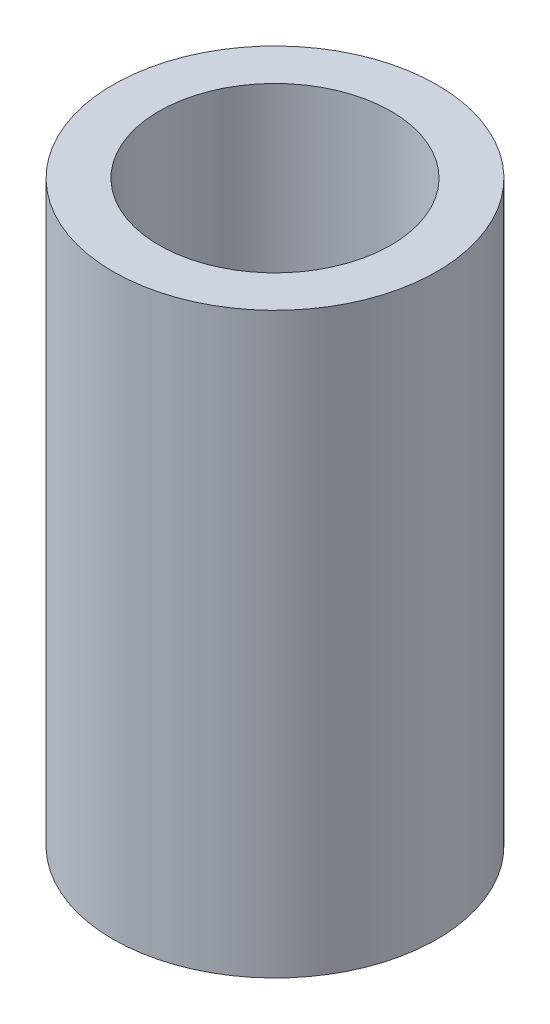
ISO-10303-21;
HEADER;
FILE_DESCRIPTION(('STEP AP214'),'2;1');
FILE_NAME('part.step','',(''),(''),'','','');
FILE_SCHEMA(('AUTOMOTIVE_DESIGN { 1 0 10303 214 1 1 1 1 }'));
ENDSEC;
DATA;
#1=APPLICATION_CONTEXT('core data for automotive mechanical design processes');
#2=APPLICATION_PROTOCOL_DEFINITION('international standard','automotive_design',2000,#1);
#3=PRODUCT_CONTEXT('',#1,'mechanical');
#4=PRODUCT('Part','Part','',(#3));
#5=PRODUCT_RELATED_PRODUCT_CATEGORY('part','',(#4));
#6=PRODUCT_DEFINITION_FORMATION('','',#4);
#7=PRODUCT_DEFINITION_CONTEXT('part definition',#1,'design');
#8=PRODUCT_DEFINITION('design','',#6,#7);
#9=PRODUCT_DEFINITION_SHAPE('','',#8);
#10=(LENGTH_UNIT() NAMED_UNIT(*) SI_UNIT(.MILLI.,.METRE.));
#11=(NAMED_UNIT(*) PLANE_ANGLE_UNIT() SI_UNIT($,.RADIAN.));
#12=(NAMED_UNIT(*) SI_UNIT($,.STERADIAN.) SOLID_ANGLE_UNIT());
#13=UNCERTAINTY_MEASURE_WITH_UNIT(LENGTH_MEASURE(1.E-05),#10,'distance_accuracy_value','');
#14=(GEOMETRIC_REPRESENTATION_CONTEXT(3) GLOBAL_UNCERTAINTY_ASSIGNED_CONTEXT((#13)) GLOBAL_UNIT_ASSIGNED_CONTEXT((#10,
#11,#12)) REPRESENTATION_CONTEXT('',''));
#15=CARTESIAN_POINT('',(0.,0.,0.));
#16=DIRECTION('',(0.,0.,1.));
#17=DIRECTION('',(1.,0.,0.));
#18=AXIS2_PLACEMENT_3D('',#15,#16,#17);
#19=CARTESIAN_POINT('',(0.,38.1,0.));
#20=DIRECTION('',(0.,1.,0.));
#21=DIRECTION('',(0.,0.,1.));
#22=AXIS2_PLACEMENT_3D('',#19,#20,#21);
#23=PLANE('',#22);
#24=CARTESIAN_POINT('',(0.,38.1,0.));
#25=DIRECTION('',(0.,1.,0.));
#26=DIRECTION('',(0.,0.,1.));
#27=AXIS2_PLACEMENT_3D('',#24,#25,#26);
#28=CIRCLE('',#27,10.668);
#29=CARTESIAN_POINT('',(0.,38.1,-10.668));
#30=VERTEX_POINT('',#29);
#31=EDGE_CURVE('E10',#30,#30,#28,.T.);
#32=ORIENTED_EDGE('',*,*,#31,.T.);
#33=EDGE_LOOP('',(#32));
#34=FACE_BOUND('',#33,.T.);
#35=CARTESIAN_POINT('',(0.,38.1,0.));
#36=DIRECTION('',(0.,1.,0.));
#37=DIRECTION('',(0.,0.,1.));
#38=AXIS2_PLACEMENT_3D('',#35,#36,#37);
#39=CIRCLE('',#38,7.6454);
#40=CARTESIAN_POINT('',(0.,38.1,-7.6454));
#41=VERTEX_POINT('',#40);
#42=EDGE_CURVE('E42',#41,#41,#39,.T.);
#43=ORIENTED_EDGE('',*,*,#42,.F.);
#44=EDGE_LOOP('',(#43));
#45=FACE_BOUND('',#44,.T.);
#46=ADVANCED_FACE('F31',(#34,#45),#23,.T.);
#47=CARTESIAN_POINT('',(0.,0.,0.));
#48=DIRECTION('',(0.,1.,0.));
#49=DIRECTION('',(0.,0.,1.));
#50=AXIS2_PLACEMENT_3D('',#47,#48,#49);
#51=PLANE('',#50);
#52=CARTESIAN_POINT('',(0.,0.,0.));
#53=DIRECTION('',(0.,1.,0.));
#54=DIRECTION('',(0.,0.,1.));
#55=AXIS2_PLACEMENT_3D('',#52,#53,#54);
#56=CIRCLE('',#55,10.668);
#57=CARTESIAN_POINT('',(0.,0.,-10.668));
#58=VERTEX_POINT('',#57);
#59=EDGE_CURVE('E35',#58,#58,#56,.T.);
#60=ORIENTED_EDGE('',*,*,#59,.F.);
#61=EDGE_LOOP('',(#60));
#62=FACE_BOUND('',#61,.T.);
#63=CARTESIAN_POINT('',(0.,0.,0.));
#64=DIRECTION('',(0.,1.,0.));
#65=DIRECTION('',(0.,0.,1.));
#66=AXIS2_PLACEMENT_3D('',#63,#64,#65);
#67=CIRCLE('',#66,7.6454);
#68=CARTESIAN_POINT('',(0.,0.,-7.6454));
#69=VERTEX_POINT('',#68);
#70=EDGE_CURVE('E44',#69,#69,#67,.T.);
#71=ORIENTED_EDGE('',*,*,#70,.T.);
#72=EDGE_LOOP('',(#71));
#73=FACE_BOUND('',#72,.T.);
#74=ADVANCED_FACE('F54',(#62,#73),#51,.F.);
#75=CARTESIAN_POINT('',(0.,38.1,0.));
#76=DIRECTION('',(0.,-1.,0.));
#77=DIRECTION('',(0.,0.,-1.));
#78=AXIS2_PLACEMENT_3D('',#75,#76,#77);
#79=CYLINDRICAL_SURFACE('',#78,10.668);
#80=CARTESIAN_POINT('',(0.,38.1,-10.668));
#81=CARTESIAN_POINT('',(0.,37.703125,-10.668));
#82=CARTESIAN_POINT('',(0.,37.30625,-10.668));
#83=CARTESIAN_POINT('',(0.,36.5125,-10.668));
#84=CARTESIAN_POINT('',(0.,36.115625,-10.668));
#85=CARTESIAN_POINT('',(0.,35.321875,-10.668));
#86=CARTESIAN_POINT('',(0.,34.925,-10.668));
#87=CARTESIAN_POINT('',(0.,34.13125,-10.668));
#88=CARTESIAN_POINT('',(0.,33.734375,-10.668));
#89=CARTESIAN_POINT('',(0.,32.940625,-10.668));
#90=CARTESIAN_POINT('',(0.,32.54375,-10.668));
#91=CARTESIAN_POINT('',(0.,31.75,-10.668));
#92=CARTESIAN_POINT('',(0.,31.353125,-10.668));
#93=CARTESIAN_POINT('',(0.,30.559375,-10.668));
#94=CARTESIAN_POINT('',(0.,30.1625,-10.668));
#95=CARTESIAN_POINT('',(0.,29.36875,-10.668));
#96=CARTESIAN_POINT('',(0.,28.971875,-10.668));
#97=CARTESIAN_POINT('',(0.,28.178125,-10.668));
#98=CARTESIAN_POINT('',(0.,27.78125,-10.668));
#99=CARTESIAN_POINT('',(0.,26.9875,-10.668));
#100=CARTESIAN_POINT('',(0.,26.590625,-10.668));
#101=CARTESIAN_POINT('',(0.,25.796875,-10.668));
#102=CARTESIAN_POINT('',(0.,25.4,-10.668));
#103=CARTESIAN_POINT('',(0.,24.60625,-10.668));
#104=CARTESIAN_POINT('',(0.,24.209375,-10.668));
#105=CARTESIAN_POINT('',(0.,23.415625,-10.668));
#106=CARTESIAN_POINT('',(0.,23.01875,-10.668));
#107=CARTESIAN_POINT('',(0.,22.225,-10.668));
#108=CARTESIAN_POINT('',(0.,21.828125,-10.668));
#109=CARTESIAN_POINT('',(0.,21.034375,-10.668));
#110=CARTESIAN_POINT('',(0.,20.6375,-10.668));
#111=CARTESIAN_POINT('',(0.,19.84375,-10.668));
#112=CARTESIAN_POINT('',(0.,19.446875,-10.668));
#113=CARTESIAN_POINT('',(0.,18.653125,-10.668));
#114=CARTESIAN_POINT('',(0.,18.25625,-10.668));
#115=CARTESIAN_POINT('',(0.,17.4625,-10.668));
#116=CARTESIAN_POINT('',(0.,17.065625,-10.668));
#117=CARTESIAN_POINT('',(0.,16.271875,-10.668));
#118=CARTESIAN_POINT('',(0.,15.875,-10.668));
#119=CARTESIAN_POINT('',(0.,15.08125,-10.668));
#120=CARTESIAN_POINT('',(0.,14.684375,-10.668));
#121=CARTESIAN_POINT('',(0.,13.890625,-10.668));
#122=CARTESIAN_POINT('',(0.,13.49375,-10.668));
#123=CARTESIAN_POINT('',(0.,12.7,-10.668));
#124=CARTESIAN_POINT('',(0.,12.303125,-10.668));
#125=CARTESIAN_POINT('',(0.,11.509375,-10.668));
#126=CARTESIAN_POINT('',(0.,11.1125,-10.668));
#127=CARTESIAN_POINT('',(0.,10.31875,-10.668));
#128=CARTESIAN_POINT('',(0.,9.92187499999999,-10.668));
#129=CARTESIAN_POINT('',(0.,9.128125,-10.668));
#130=CARTESIAN_POINT('',(0.,8.73124999999999,-10.668));
#131=CARTESIAN_POINT('',(0.,7.93749999999999,-10.668));
#132=CARTESIAN_POINT('',(0.,7.54062499999999,-10.668));
#133=CARTESIAN_POINT('',(0.,6.746875,-10.668));
#134=CARTESIAN_POINT('',(0.,6.35,-10.668));
#135=CARTESIAN_POINT('',(0.,5.55625,-10.668));
#136=CARTESIAN_POINT('',(0.,5.159375,-10.668));
#137=CARTESIAN_POINT('',(0.,4.365625,-10.668));
#138=CARTESIAN_POINT('',(0.,3.96875,-10.668));
#139=CARTESIAN_POINT('',(0.,3.175,-10.668));
#140=CARTESIAN_POINT('',(0.,2.778125,-10.668));
#141=CARTESIAN_POINT('',(0.,1.984375,-10.668));
#142=CARTESIAN_POINT('',(0.,1.5875,-10.668));
#143=CARTESIAN_POINT('',(0.,0.79375,-10.668));
#144=CARTESIAN_POINT('',(0.,0.396875,-10.668));
#145=CARTESIAN_POINT('',(0.,0.,-10.668));
#146=B_SPLINE_CURVE_WITH_KNOTS('',3,(#80,#81,#82,#83,#84,#85,#86,#87,#88,#89,#90,#91,#92,#93,
#94,#95,#96,#97,#98,#99,#100,#101,#102,#103,#104,#105,#106,#107,#108,#109,#110,#111,#112,#113,
#114,#115,#116,#117,#118,#119,#120,#121,#122,#123,#124,#125,#126,#127,#128,#129,#130,#131,#132,
#133,#134,#135,#136,#137,#138,#139,#140,#141,#142,#143,#144,#145),.UNSPECIFIED.,.F.,.F.,(4,2,2,
2,2,2,2,2,2,2,2,2,2,2,2,2,2,2,2,2,2,2,2,2,2,2,2,2,2,2,2,2,4),(0.,1.190625,2.38125,3.571875,
4.7625,5.953125,7.14375,8.334375,9.52500000000001,10.715625,11.90625,13.096875,14.2875,
15.478125,16.66875,17.859375,19.05,20.240625,21.43125,22.621875,23.8125,25.003125,26.19375,
27.384375,28.575,29.765625,30.95625,32.146875,33.3375,34.528125,35.71875,36.909375,38.1),.UNSPECIFIED.);
#147=EDGE_CURVE('BSEAM33',#30,#58,#146,.T.);
#148=ORIENTED_EDGE('',*,*,#31,.F.);
#149=ORIENTED_EDGE('',*,*,#59,.T.);
#150=ORIENTED_EDGE('',*,*,#147,.T.);
#151=ORIENTED_EDGE('',*,*,#147,.F.);
#152=EDGE_LOOP('',(#148,#150,#149,#151));
#153=FACE_BOUND('',#152,.T.);
#154=ADVANCED_FACE('F33',(#153),#79,.T.);
#155=CARTESIAN_POINT('',(0.,38.1,0.));
#156=DIRECTION('',(0.,-1.,0.));
#157=DIRECTION('',(0.,0.,-1.));
#158=AXIS2_PLACEMENT_3D('',#155,#156,#157);
#159=CYLINDRICAL_SURFACE('',#158,7.6454);
#160=CARTESIAN_POINT('',(0.,38.1,-7.6454));
#161=CARTESIAN_POINT('',(0.,37.703125,-7.6454));
#162=CARTESIAN_POINT('',(0.,37.30625,-7.6454));
#163=CARTESIAN_POINT('',(0.,36.5125,-7.6454));
#164=CARTESIAN_POINT('',(0.,36.115625,-7.6454));
#165=CARTESIAN_POINT('',(0.,35.321875,-7.6454));
#166=CARTESIAN_POINT('',(0.,34.925,-7.6454));
#167=CARTESIAN_POINT('',(0.,34.13125,-7.6454));
#168=CARTESIAN_POINT('',(0.,33.734375,-7.6454));
#169=CARTESIAN_POINT('',(0.,32.940625,-7.6454));
#170=CARTESIAN_POINT('',(0.,32.54375,-7.6454));
#171=CARTESIAN_POINT('',(0.,31.75,-7.6454));
#172=CARTESIAN_POINT('',(0.,31.353125,-7.6454));
#173=CARTESIAN_POINT('',(0.,30.559375,-7.6454));
#174=CARTESIAN_POINT('',(0.,30.1625,-7.6454));
#175=CARTESIAN_POINT('',(0.,29.36875,-7.6454));
#176=CARTESIAN_POINT('',(0.,28.971875,-7.6454));
#177=CARTESIAN_POINT('',(0.,28.178125,-7.6454));
#178=CARTESIAN_POINT('',(0.,27.78125,-7.6454));
#179=CARTESIAN_POINT('',(0.,26.9875,-7.6454));
#180=CARTESIAN_POINT('',(0.,26.590625,-7.6454));
#181=CARTESIAN_POINT('',(0.,25.796875,-7.6454));
#182=CARTESIAN_POINT('',(0.,25.4,-7.6454));
#183=CARTESIAN_POINT('',(0.,24.60625,-7.6454));
#184=CARTESIAN_POINT('',(0.,24.209375,-7.6454));
#185=CARTESIAN_POINT('',(0.,23.415625,-7.6454));
#186=CARTESIAN_POINT('',(0.,23.01875,-7.6454));
#187=CARTESIAN_POINT('',(0.,22.225,-7.6454));
#188=CARTESIAN_POINT('',(0.,21.828125,-7.6454));
#189=CARTESIAN_POINT('',(0.,21.034375,-7.6454));
#190=CARTESIAN_POINT('',(0.,20.6375,-7.6454));
#191=CARTESIAN_POINT('',(0.,19.84375,-7.6454));
#192=CARTESIAN_POINT('',(0.,19.446875,-7.6454));
#193=CARTESIAN_POINT('',(0.,18.653125,-7.6454));
#194=CARTESIAN_POINT('',(0.,18.25625,-7.6454));
#195=CARTESIAN_POINT('',(0.,17.4625,-7.6454));
#196=CARTESIAN_POINT('',(0.,17.065625,-7.6454));
#197=CARTESIAN_POINT('',(0.,16.271875,-7.6454));
#198=CARTESIAN_POINT('',(0.,15.875,-7.6454));
#199=CARTESIAN_POINT('',(0.,15.08125,-7.6454));
#200=CARTESIAN_POINT('',(0.,14.684375,-7.6454));
#201=CARTESIAN_POINT('',(0.,13.890625,-7.6454));
#202=CARTESIAN_POINT('',(0.,13.49375,-7.6454));
#203=CARTESIAN_POINT('',(0.,12.7,-7.6454));
#204=CARTESIAN_POINT('',(0.,12.303125,-7.6454));
#205=CARTESIAN_POINT('',(0.,11.509375,-7.6454));
#206=CARTESIAN_POINT('',(0.,11.1125,-7.6454));
#207=CARTESIAN_POINT('',(0.,10.31875,-7.6454));
#208=CARTESIAN_POINT('',(0.,9.92187499999999,-7.6454));
#209=CARTESIAN_POINT('',(0.,9.128125,-7.6454));
#210=CARTESIAN_POINT('',(0.,8.73124999999999,-7.6454));
#211=CARTESIAN_POINT('',(0.,7.93749999999999,-7.6454));
#212=CARTESIAN_POINT('',(0.,7.54062499999999,-7.6454));
#213=CARTESIAN_POINT('',(0.,6.746875,-7.6454));
#214=CARTESIAN_POINT('',(0.,6.35,-7.6454));
#215=CARTESIAN_POINT('',(0.,5.55625,-7.6454));
#216=CARTESIAN_POINT('',(0.,5.159375,-7.6454));
#217=CARTESIAN_POINT('',(0.,4.365625,-7.6454));
#218=CARTESIAN_POINT('',(0.,3.96875,-7.6454));
#219=CARTESIAN_POINT('',(0.,3.175,-7.6454));
#220=CARTESIAN_POINT('',(0.,2.778125,-7.6454));
#221=CARTESIAN_POINT('',(0.,1.984375,-7.6454));
#222=CARTESIAN_POINT('',(0.,1.5875,-7.6454));
#223=CARTESIAN_POINT('',(0.,0.79375,-7.6454));
#224=CARTESIAN_POINT('',(0.,0.396875,-7.6454));
#225=CARTESIAN_POINT('',(0.,0.,-7.6454));
#226=B_SPLINE_CURVE_WITH_KNOTS('',3,(#160,#161,#162,#163,#164,#165,#166,#167,#168,#169,#170,
#171,#172,#173,#174,#175,#176,#177,#178,#179,#180,#181,#182,#183,#184,#185,#186,#187,#188,#189,
#190,#191,#192,#193,#194,#195,#196,#197,#198,#199,#200,#201,#202,#203,#204,#205,#206,#207,#208,
#209,#210,#211,#212,#213,#214,#215,#216,#217,#218,#219,#220,#221,#222,#223,#224,#225),
.UNSPECIFIED.,.F.,.F.,(4,2,2,2,2,2,2,2,2,2,2,2,2,2,2,2,2,2,2,2,2,2,2,2,2,2,2,2,2,2,2,2,4),(0.,
1.190625,2.38125,3.571875,4.7625,5.953125,7.14375,8.334375,9.52500000000001,10.715625,11.90625,
13.096875,14.2875,15.478125,16.66875,17.859375,19.05,20.240625,21.43125,22.621875,23.8125,
25.003125,26.19375,27.384375,28.575,29.765625,30.95625,32.146875,33.3375,34.528125,35.71875,
36.909375,38.1),.UNSPECIFIED.);
#227=EDGE_CURVE('BSEAM50',#41,#69,#226,.T.);
#228=ORIENTED_EDGE('',*,*,#42,.T.);
#229=ORIENTED_EDGE('',*,*,#70,.F.);
#230=ORIENTED_EDGE('',*,*,#227,.T.);
#231=ORIENTED_EDGE('',*,*,#227,.F.);
#232=EDGE_LOOP('',(#228,#230,#229,#231));
#233=FACE_BOUND('',#232,.T.);
#234=ADVANCED_FACE('F50',(#233),#159,.F.);
#235=CLOSED_SHELL('',(#46,#74,#154,#234));
#236=MANIFOLD_SOLID_BREP('B2',#235);
#237=ADVANCED_BREP_SHAPE_REPRESENTATION('',(#18,#236),#14);
#238=SHAPE_DEFINITION_REPRESENTATION(#9,#237);
ENDSEC;
END-ISO-10303-21;
